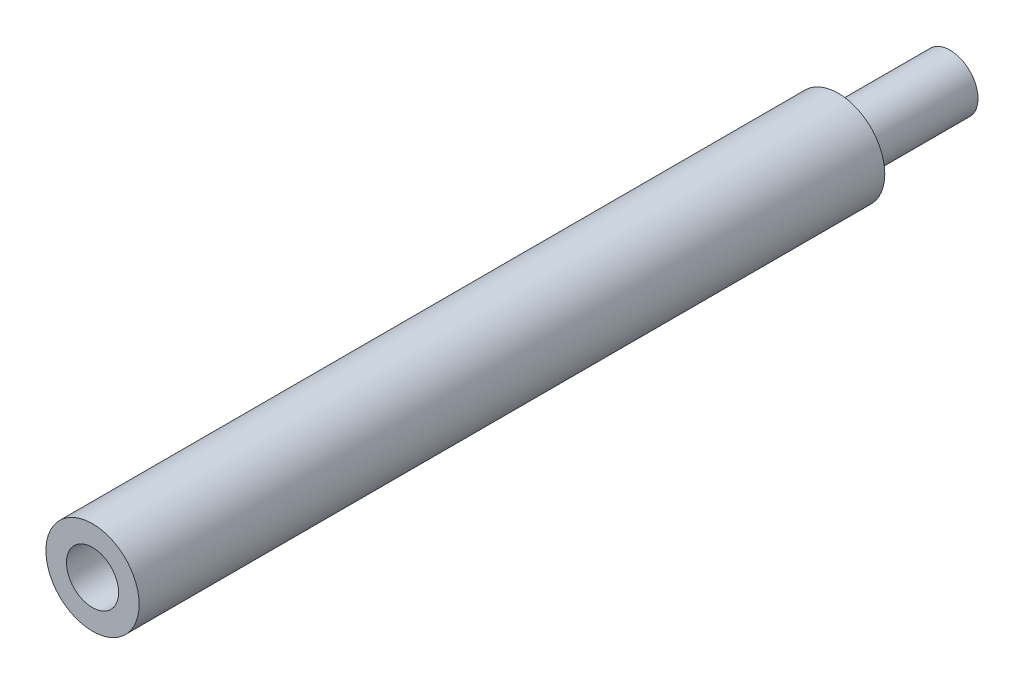
ISO-10303-21;
HEADER;
FILE_DESCRIPTION(('STEP AP214'),'2;1');
FILE_NAME('part.step','',(''),(''),'','','');
FILE_SCHEMA(('AUTOMOTIVE_DESIGN { 1 0 10303 214 1 1 1 1 }'));
ENDSEC;
DATA;
#1=APPLICATION_CONTEXT('core data for automotive mechanical design processes');
#2=APPLICATION_PROTOCOL_DEFINITION('international standard','automotive_design',2000,#1);
#3=PRODUCT_CONTEXT('',#1,'mechanical');
#4=PRODUCT('Part','Part','',(#3));
#5=PRODUCT_RELATED_PRODUCT_CATEGORY('part','',(#4));
#6=PRODUCT_DEFINITION_FORMATION('','',#4);
#7=PRODUCT_DEFINITION_CONTEXT('part definition',#1,'design');
#8=PRODUCT_DEFINITION('design','',#6,#7);
#9=PRODUCT_DEFINITION_SHAPE('','',#8);
#10=(LENGTH_UNIT() NAMED_UNIT(*) SI_UNIT(.MILLI.,.METRE.));
#11=(NAMED_UNIT(*) PLANE_ANGLE_UNIT() SI_UNIT($,.RADIAN.));
#12=(NAMED_UNIT(*) SI_UNIT($,.STERADIAN.) SOLID_ANGLE_UNIT());
#13=UNCERTAINTY_MEASURE_WITH_UNIT(LENGTH_MEASURE(1.E-05),#10,'distance_accuracy_value','');
#14=(GEOMETRIC_REPRESENTATION_CONTEXT(3) GLOBAL_UNCERTAINTY_ASSIGNED_CONTEXT((#13)) GLOBAL_UNIT_ASSIGNED_CONTEXT((#10,
#11,#12)) REPRESENTATION_CONTEXT('',''));
#15=CARTESIAN_POINT('',(0.,0.,0.));
#16=DIRECTION('',(0.,0.,1.));
#17=DIRECTION('',(1.,0.,0.));
#18=AXIS2_PLACEMENT_3D('',#15,#16,#17);
#19=CARTESIAN_POINT('',(0.,0.,40.));
#20=DIRECTION('',(0.,0.,1.));
#21=DIRECTION('',(1.,0.,0.));
#22=AXIS2_PLACEMENT_3D('',#19,#20,#21);
#23=PLANE('',#22);
#24=CARTESIAN_POINT('',(0.,0.,40.));
#25=DIRECTION('',(0.,0.,1.));
#26=DIRECTION('',(1.,0.,0.));
#27=AXIS2_PLACEMENT_3D('',#24,#25,#26);
#28=CIRCLE('',#27,2.5);
#29=CARTESIAN_POINT('',(2.5,0.,40.));
#30=VERTEX_POINT('',#29);
#31=EDGE_CURVE('E45',#30,#30,#28,.T.);
#32=ORIENTED_EDGE('',*,*,#31,.T.);
#33=EDGE_LOOP('',(#32));
#34=FACE_BOUND('',#33,.T.);
#35=CARTESIAN_POINT('',(0.,0.,40.));
#36=DIRECTION('',(0.,0.,1.));
#37=DIRECTION('',(1.,0.,0.));
#38=AXIS2_PLACEMENT_3D('',#35,#36,#37);
#39=CIRCLE('',#38,1.4);
#40=CARTESIAN_POINT('',(1.4,0.,40.));
#41=VERTEX_POINT('',#40);
#42=EDGE_CURVE('E56',#41,#41,#39,.T.);
#43=ORIENTED_EDGE('',*,*,#42,.F.);
#44=EDGE_LOOP('',(#43));
#45=FACE_BOUND('',#44,.T.);
#46=ADVANCED_FACE('F37',(#34,#45),#23,.T.);
#47=CARTESIAN_POINT('',(0.,0.,0.));
#48=DIRECTION('',(0.,0.,1.));
#49=DIRECTION('',(1.,0.,0.));
#50=AXIS2_PLACEMENT_3D('',#47,#48,#49);
#51=PLANE('',#50);
#52=CARTESIAN_POINT('',(0.,0.,0.));
#53=DIRECTION('',(0.,0.,1.));
#54=DIRECTION('',(1.,0.,0.));
#55=AXIS2_PLACEMENT_3D('',#52,#53,#54);
#56=CIRCLE('',#55,1.5);
#57=CARTESIAN_POINT('',(1.5,0.,0.));
#58=VERTEX_POINT('',#57);
#59=EDGE_CURVE('E10',#58,#58,#56,.F.);
#60=ORIENTED_EDGE('',*,*,#59,.F.);
#61=EDGE_LOOP('',(#60));
#62=FACE_BOUND('',#61,.T.);
#63=CARTESIAN_POINT('',(0.,0.,0.));
#64=DIRECTION('',(0.,0.,1.));
#65=DIRECTION('',(1.,0.,0.));
#66=AXIS2_PLACEMENT_3D('',#63,#64,#65);
#67=CIRCLE('',#66,2.5);
#68=CARTESIAN_POINT('',(2.5,0.,0.));
#69=VERTEX_POINT('',#68);
#70=EDGE_CURVE('E50',#69,#69,#67,.T.);
#71=ORIENTED_EDGE('',*,*,#70,.F.);
#72=EDGE_LOOP('',(#71));
#73=FACE_BOUND('',#72,.T.);
#74=ADVANCED_FACE('F86',(#62,#73),#51,.F.);
#75=CARTESIAN_POINT('',(0.,0.,40.));
#76=DIRECTION('',(0.,0.,-1.));
#77=DIRECTION('',(-1.,0.,0.));
#78=AXIS2_PLACEMENT_3D('',#75,#76,#77);
#79=CYLINDRICAL_SURFACE('',#78,2.5);
#80=ORIENTED_EDGE('',*,*,#31,.F.);
#81=EDGE_LOOP('',(#80));
#82=FACE_BOUND('',#81,.T.);
#83=ORIENTED_EDGE('',*,*,#70,.T.);
#84=EDGE_LOOP('',(#83));
#85=FACE_BOUND('',#84,.T.);
#86=ADVANCED_FACE('F39',(#82,#85),#79,.T.);
#87=CARTESIAN_POINT('',(0.,0.,40.));
#88=DIRECTION('',(0.,0.,-1.));
#89=DIRECTION('',(-1.,0.,0.));
#90=AXIS2_PLACEMENT_3D('',#87,#88,#89);
#91=CYLINDRICAL_SURFACE('',#90,1.4);
#92=ORIENTED_EDGE('',*,*,#42,.T.);
#93=EDGE_LOOP('',(#92));
#94=FACE_BOUND('',#93,.T.);
#95=CARTESIAN_POINT('',(0.,0.,0.));
#96=DIRECTION('',(0.,0.,1.));
#97=DIRECTION('',(1.,0.,0.));
#98=AXIS2_PLACEMENT_3D('',#95,#96,#97);
#99=CIRCLE('',#98,1.4);
#100=CARTESIAN_POINT('',(1.4,0.,0.));
#101=VERTEX_POINT('',#100);
#102=EDGE_CURVE('E58',#101,#101,#99,.T.);
#103=ORIENTED_EDGE('',*,*,#102,.F.);
#104=EDGE_LOOP('',(#103));
#105=FACE_BOUND('',#104,.T.);
#106=ADVANCED_FACE('F81',(#94,#105),#91,.F.);
#107=CARTESIAN_POINT('',(0.,0.,0.));
#108=DIRECTION('',(0.,0.,-1.));
#109=DIRECTION('',(-1.,0.,0.));
#110=AXIS2_PLACEMENT_3D('',#107,#108,#109);
#111=PLANE('',#110);
#112=ORIENTED_EDGE('',*,*,#102,.T.);
#113=EDGE_LOOP('',(#112));
#114=FACE_BOUND('',#113,.T.);
#115=ADVANCED_FACE('F74',(#114),#111,.F.);
#116=CARTESIAN_POINT('',(0.,0.,-6.));
#117=DIRECTION('',(0.,0.,1.));
#118=DIRECTION('',(1.,0.,0.));
#119=AXIS2_PLACEMENT_3D('',#116,#117,#118);
#120=CYLINDRICAL_SURFACE('',#119,1.5);
#121=CARTESIAN_POINT('',(0.,0.,-6.));
#122=DIRECTION('',(0.,0.,-1.));
#123=DIRECTION('',(-1.,0.,0.));
#124=AXIS2_PLACEMENT_3D('',#121,#122,#123);
#125=CIRCLE('',#124,1.5);
#126=CARTESIAN_POINT('',(-1.5,0.,-6.));
#127=VERTEX_POINT('',#126);
#128=EDGE_CURVE('E62',#127,#127,#125,.T.);
#129=ORIENTED_EDGE('',*,*,#128,.F.);
#130=EDGE_LOOP('',(#129));
#131=FACE_BOUND('',#130,.T.);
#132=ORIENTED_EDGE('',*,*,#59,.T.);
#133=EDGE_LOOP('',(#132));
#134=FACE_BOUND('',#133,.T.);
#135=ADVANCED_FACE('F72',(#131,#134),#120,.T.);
#136=CARTESIAN_POINT('',(0.,0.,-6.));
#137=DIRECTION('',(0.,0.,-1.));
#138=DIRECTION('',(-1.,0.,0.));
#139=AXIS2_PLACEMENT_3D('',#136,#137,#138);
#140=PLANE('',#139);
#141=ORIENTED_EDGE('',*,*,#128,.T.);
#142=EDGE_LOOP('',(#141));
#143=FACE_BOUND('',#142,.T.);
#144=ADVANCED_FACE('F70',(#143),#140,.T.);
#145=CLOSED_SHELL('',(#46,#74,#86,#106,#115,#135,#144));
#146=MANIFOLD_SOLID_BREP('B2',#145);
#147=ADVANCED_BREP_SHAPE_REPRESENTATION('',(#18,#146),#14);
#148=SHAPE_DEFINITION_REPRESENTATION(#9,#147);
ENDSEC;
END-ISO-10303-21;
